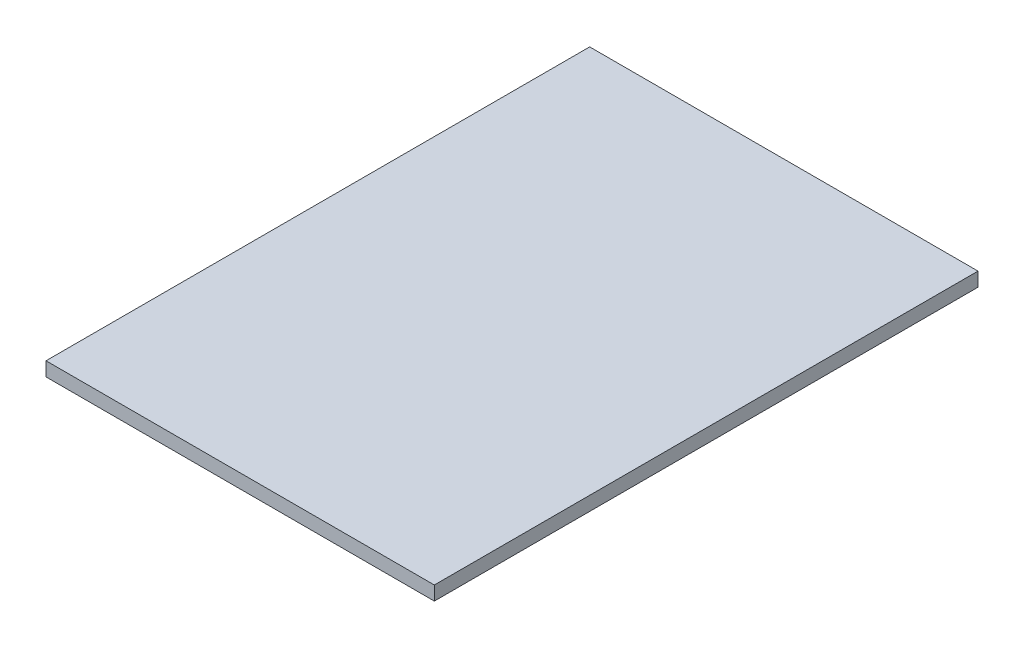
ISO-10303-21;
HEADER;
FILE_DESCRIPTION(('STEP AP214'),'2;1');
FILE_NAME('part.step','',(''),(''),'','','');
FILE_SCHEMA(('AUTOMOTIVE_DESIGN { 1 0 10303 214 1 1 1 1 }'));
ENDSEC;
DATA;
#1=APPLICATION_CONTEXT('core data for automotive mechanical design processes');
#2=APPLICATION_PROTOCOL_DEFINITION('international standard','automotive_design',2000,#1);
#3=PRODUCT_CONTEXT('',#1,'mechanical');
#4=PRODUCT('Part','Part','',(#3));
#5=PRODUCT_RELATED_PRODUCT_CATEGORY('part','',(#4));
#6=PRODUCT_DEFINITION_FORMATION('','',#4);
#7=PRODUCT_DEFINITION_CONTEXT('part definition',#1,'design');
#8=PRODUCT_DEFINITION('design','',#6,#7);
#9=PRODUCT_DEFINITION_SHAPE('','',#8);
#10=(LENGTH_UNIT() NAMED_UNIT(*) SI_UNIT(.MILLI.,.METRE.));
#11=(NAMED_UNIT(*) PLANE_ANGLE_UNIT() SI_UNIT($,.RADIAN.));
#12=(NAMED_UNIT(*) SI_UNIT($,.STERADIAN.) SOLID_ANGLE_UNIT());
#13=UNCERTAINTY_MEASURE_WITH_UNIT(LENGTH_MEASURE(1.E-05),#10,'distance_accuracy_value','');
#14=(GEOMETRIC_REPRESENTATION_CONTEXT(3) GLOBAL_UNCERTAINTY_ASSIGNED_CONTEXT((#13)) GLOBAL_UNIT_ASSIGNED_CONTEXT((#10,
#11,#12)) REPRESENTATION_CONTEXT('',''));
#15=CARTESIAN_POINT('',(0.,0.,0.));
#16=DIRECTION('',(0.,0.,1.));
#17=DIRECTION('',(1.,0.,0.));
#18=AXIS2_PLACEMENT_3D('',#15,#16,#17);
#19=CARTESIAN_POINT('',(250.,18.,-350.));
#20=DIRECTION('',(-1.,0.,0.));
#21=DIRECTION('',(0.,0.,1.));
#22=AXIS2_PLACEMENT_3D('',#19,#20,#21);
#23=PLANE('',#22);
#24=DIRECTION('',(0.,0.,-1.));
#25=VECTOR('',#24,1.);
#26=CARTESIAN_POINT('',(250.,0.,-350.));
#27=LINE('',#26,#25);
#28=CARTESIAN_POINT('',(250.,0.,350.));
#29=VERTEX_POINT('',#28);
#30=CARTESIAN_POINT('',(250.,0.,-350.));
#31=VERTEX_POINT('',#30);
#32=EDGE_CURVE('E96',#29,#31,#27,.T.);
#33=ORIENTED_EDGE('',*,*,#32,.T.);
#34=DIRECTION('',(0.,-1.,0.));
#35=VECTOR('',#34,1.);
#36=CARTESIAN_POINT('',(250.,18.,-350.));
#37=LINE('',#36,#35);
#38=CARTESIAN_POINT('',(250.,18.,-350.));
#39=VERTEX_POINT('',#38);
#40=EDGE_CURVE('E11',#39,#31,#37,.T.);
#41=ORIENTED_EDGE('',*,*,#40,.F.);
#42=DIRECTION('',(0.,0.,-1.));
#43=VECTOR('',#42,1.);
#44=CARTESIAN_POINT('',(250.,18.,-350.));
#45=LINE('',#44,#43);
#46=CARTESIAN_POINT('',(250.,18.,350.));
#47=VERTEX_POINT('',#46);
#48=EDGE_CURVE('E84',#47,#39,#45,.T.);
#49=ORIENTED_EDGE('',*,*,#48,.F.);
#50=DIRECTION('',(0.,-1.,0.));
#51=VECTOR('',#50,1.);
#52=CARTESIAN_POINT('',(250.,18.,350.));
#53=LINE('',#52,#51);
#54=EDGE_CURVE('E92',#47,#29,#53,.T.);
#55=ORIENTED_EDGE('',*,*,#54,.T.);
#56=EDGE_LOOP('',(#33,#41,#49,#55));
#57=FACE_BOUND('',#56,.T.);
#58=ADVANCED_FACE('F33',(#57),#23,.F.);
#59=CARTESIAN_POINT('',(-250.,18.,-350.));
#60=DIRECTION('',(0.,0.,1.));
#61=DIRECTION('',(1.,0.,0.));
#62=AXIS2_PLACEMENT_3D('',#59,#60,#61);
#63=PLANE('',#62);
#64=DIRECTION('',(-1.,0.,0.));
#65=VECTOR('',#64,1.);
#66=CARTESIAN_POINT('',(-250.,0.,-350.));
#67=LINE('',#66,#65);
#68=CARTESIAN_POINT('',(-250.,0.,-350.));
#69=VERTEX_POINT('',#68);
#70=EDGE_CURVE('E88',#31,#69,#67,.T.);
#71=ORIENTED_EDGE('',*,*,#70,.T.);
#72=DIRECTION('',(0.,-1.,0.));
#73=VECTOR('',#72,1.);
#74=CARTESIAN_POINT('',(-250.,18.,-350.));
#75=LINE('',#74,#73);
#76=CARTESIAN_POINT('',(-250.,18.,-350.));
#77=VERTEX_POINT('',#76);
#78=EDGE_CURVE('E41',#77,#69,#75,.T.);
#79=ORIENTED_EDGE('',*,*,#78,.F.);
#80=DIRECTION('',(-1.,0.,0.));
#81=VECTOR('',#80,1.);
#82=CARTESIAN_POINT('',(-250.,18.,-350.));
#83=LINE('',#82,#81);
#84=EDGE_CURVE('E79',#39,#77,#83,.T.);
#85=ORIENTED_EDGE('',*,*,#84,.F.);
#86=ORIENTED_EDGE('',*,*,#40,.T.);
#87=EDGE_LOOP('',(#71,#79,#85,#86));
#88=FACE_BOUND('',#87,.T.);
#89=ADVANCED_FACE('F87',(#88),#63,.F.);
#90=CARTESIAN_POINT('',(-250.,18.,-350.));
#91=DIRECTION('',(1.,0.,0.));
#92=DIRECTION('',(0.,0.,-1.));
#93=AXIS2_PLACEMENT_3D('',#90,#91,#92);
#94=PLANE('',#93);
#95=DIRECTION('',(0.,0.,1.));
#96=VECTOR('',#95,1.);
#97=CARTESIAN_POINT('',(-250.,0.,-350.));
#98=LINE('',#97,#96);
#99=CARTESIAN_POINT('',(-250.,0.,350.));
#100=VERTEX_POINT('',#99);
#101=EDGE_CURVE('E66',#69,#100,#98,.T.);
#102=ORIENTED_EDGE('',*,*,#101,.T.);
#103=DIRECTION('',(0.,-1.,0.));
#104=VECTOR('',#103,1.);
#105=CARTESIAN_POINT('',(-250.,18.,350.));
#106=LINE('',#105,#104);
#107=CARTESIAN_POINT('',(-250.,18.,350.));
#108=VERTEX_POINT('',#107);
#109=EDGE_CURVE('E89',#108,#100,#106,.T.);
#110=ORIENTED_EDGE('',*,*,#109,.F.);
#111=DIRECTION('',(0.,0.,1.));
#112=VECTOR('',#111,1.);
#113=CARTESIAN_POINT('',(-250.,18.,-350.));
#114=LINE('',#113,#112);
#115=EDGE_CURVE('E82',#77,#108,#114,.T.);
#116=ORIENTED_EDGE('',*,*,#115,.F.);
#117=ORIENTED_EDGE('',*,*,#78,.T.);
#118=EDGE_LOOP('',(#102,#110,#116,#117));
#119=FACE_BOUND('',#118,.T.);
#120=ADVANCED_FACE('F90',(#119),#94,.F.);
#121=CARTESIAN_POINT('',(-250.,18.,350.));
#122=DIRECTION('',(0.,0.,-1.));
#123=DIRECTION('',(-1.,0.,0.));
#124=AXIS2_PLACEMENT_3D('',#121,#122,#123);
#125=PLANE('',#124);
#126=DIRECTION('',(1.,0.,0.));
#127=VECTOR('',#126,1.);
#128=CARTESIAN_POINT('',(-250.,0.,350.));
#129=LINE('',#128,#127);
#130=EDGE_CURVE('E72',#100,#29,#129,.T.);
#131=ORIENTED_EDGE('',*,*,#130,.T.);
#132=ORIENTED_EDGE('',*,*,#54,.F.);
#133=DIRECTION('',(1.,0.,0.));
#134=VECTOR('',#133,1.);
#135=CARTESIAN_POINT('',(-250.,18.,350.));
#136=LINE('',#135,#134);
#137=EDGE_CURVE('E49',#108,#47,#136,.T.);
#138=ORIENTED_EDGE('',*,*,#137,.F.);
#139=ORIENTED_EDGE('',*,*,#109,.T.);
#140=EDGE_LOOP('',(#131,#132,#138,#139));
#141=FACE_BOUND('',#140,.T.);
#142=ADVANCED_FACE('F103',(#141),#125,.F.);
#143=CARTESIAN_POINT('',(0.,18.,0.));
#144=DIRECTION('',(0.,1.,0.));
#145=DIRECTION('',(0.,0.,1.));
#146=AXIS2_PLACEMENT_3D('',#143,#144,#145);
#147=PLANE('',#146);
#148=ORIENTED_EDGE('',*,*,#48,.T.);
#149=ORIENTED_EDGE('',*,*,#84,.T.);
#150=ORIENTED_EDGE('',*,*,#115,.T.);
#151=ORIENTED_EDGE('',*,*,#137,.T.);
#152=EDGE_LOOP('',(#148,#149,#150,#151));
#153=FACE_BOUND('',#152,.T.);
#154=ADVANCED_FACE('F80',(#153),#147,.T.);
#155=CARTESIAN_POINT('',(0.,0.,0.));
#156=DIRECTION('',(0.,1.,0.));
#157=DIRECTION('',(0.,0.,1.));
#158=AXIS2_PLACEMENT_3D('',#155,#156,#157);
#159=PLANE('',#158);
#160=ORIENTED_EDGE('',*,*,#32,.F.);
#161=ORIENTED_EDGE('',*,*,#130,.F.);
#162=ORIENTED_EDGE('',*,*,#101,.F.);
#163=ORIENTED_EDGE('',*,*,#70,.F.);
#164=EDGE_LOOP('',(#160,#161,#162,#163));
#165=FACE_BOUND('',#164,.T.);
#166=ADVANCED_FACE('F106',(#165),#159,.F.);
#167=CLOSED_SHELL('',(#58,#89,#120,#142,#154,#166));
#168=MANIFOLD_SOLID_BREP('B2',#167);
#169=ADVANCED_BREP_SHAPE_REPRESENTATION('',(#18,#168),#14);
#170=SHAPE_DEFINITION_REPRESENTATION(#9,#169);
ENDSEC;
END-ISO-10303-21;
